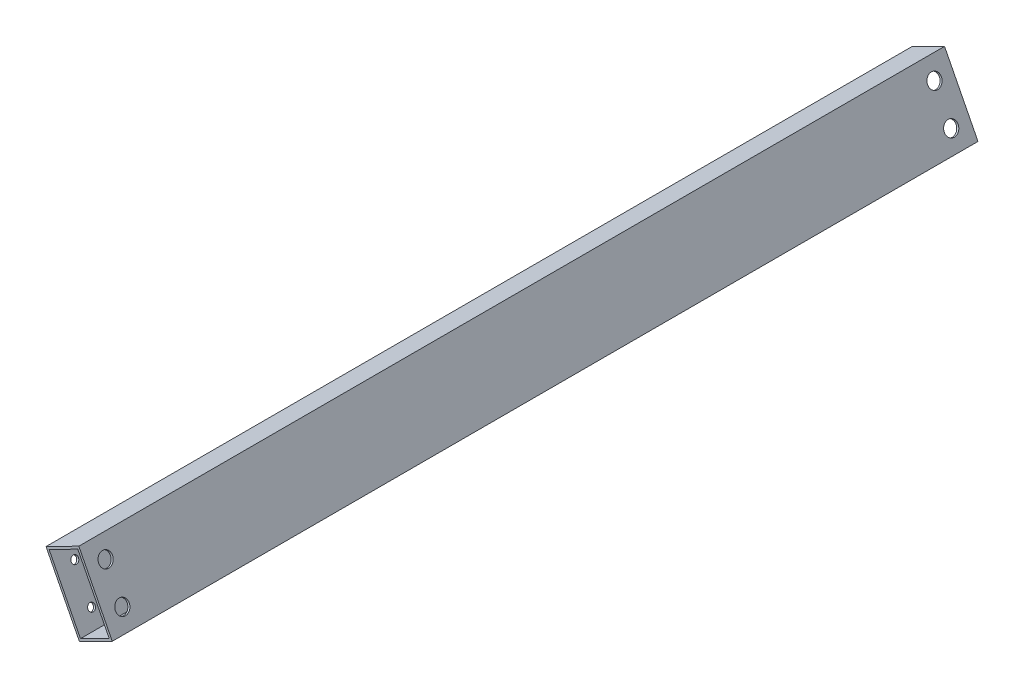
ISO-10303-21;
HEADER;
FILE_DESCRIPTION(('STEP AP214'),'2;1');
FILE_NAME('part.step','',(''),(''),'','','');
FILE_SCHEMA(('AUTOMOTIVE_DESIGN { 1 0 10303 214 1 1 1 1 }'));
ENDSEC;
DATA;
#1=APPLICATION_CONTEXT('core data for automotive mechanical design processes');
#2=APPLICATION_PROTOCOL_DEFINITION('international standard','automotive_design',2000,#1);
#3=PRODUCT_CONTEXT('',#1,'mechanical');
#4=PRODUCT('Part','Part','',(#3));
#5=PRODUCT_RELATED_PRODUCT_CATEGORY('part','',(#4));
#6=PRODUCT_DEFINITION_FORMATION('','',#4);
#7=PRODUCT_DEFINITION_CONTEXT('part definition',#1,'design');
#8=PRODUCT_DEFINITION('design','',#6,#7);
#9=PRODUCT_DEFINITION_SHAPE('','',#8);
#10=(LENGTH_UNIT() NAMED_UNIT(*) SI_UNIT(.MILLI.,.METRE.));
#11=(NAMED_UNIT(*) PLANE_ANGLE_UNIT() SI_UNIT($,.RADIAN.));
#12=(NAMED_UNIT(*) SI_UNIT($,.STERADIAN.) SOLID_ANGLE_UNIT());
#13=UNCERTAINTY_MEASURE_WITH_UNIT(LENGTH_MEASURE(1.E-05),#10,'distance_accuracy_value','');
#14=(GEOMETRIC_REPRESENTATION_CONTEXT(3) GLOBAL_UNCERTAINTY_ASSIGNED_CONTEXT((#13)) GLOBAL_UNIT_ASSIGNED_CONTEXT((#10,
#11,#12)) REPRESENTATION_CONTEXT('',''));
#15=CARTESIAN_POINT('',(0.,0.,0.));
#16=DIRECTION('',(0.,0.,1.));
#17=DIRECTION('',(1.,0.,0.));
#18=AXIS2_PLACEMENT_3D('',#15,#16,#17);
#19=CARTESIAN_POINT('',(327.781207122114,625.19456346968,298.45));
#20=DIRECTION('',(0.,0.,1.));
#21=DIRECTION('',(1.,0.,0.));
#22=AXIS2_PLACEMENT_3D('',#19,#20,#21);
#23=PLANE('',#22);
#24=DIRECTION('',(0.453990499739551,-0.891006524188366,0.));
#25=VECTOR('',#24,1.);
#26=CARTESIAN_POINT('',(350.412772836498,636.725922163065,298.45));
#27=LINE('',#26,#25);
#28=CARTESIAN_POINT('',(327.350055449729,681.989053591834,298.45));
#29=VERTEX_POINT('',#28);
#30=CARTESIAN_POINT('',(350.412772836498,636.725922163065,298.45));
#31=VERTEX_POINT('',#30);
#32=EDGE_CURVE('E135',#29,#31,#27,.T.);
#33=ORIENTED_EDGE('',*,*,#32,.F.);
#34=DIRECTION('',(0.891006524188365,0.453990499739552,0.));
#35=VECTOR('',#34,1.);
#36=CARTESIAN_POINT('',(304.718489735344,670.457694898449,298.45));
#37=LINE('',#36,#35);
#38=CARTESIAN_POINT('',(304.718489735344,670.457694898449,298.45));
#39=VERTEX_POINT('',#38);
#40=EDGE_CURVE('E11',#39,#29,#37,.T.);
#41=ORIENTED_EDGE('',*,*,#40,.F.);
#42=DIRECTION('',(0.453990499739551,-0.891006524188366,0.));
#43=VECTOR('',#42,1.);
#44=CARTESIAN_POINT('',(327.781207122114,625.19456346968,298.45));
#45=LINE('',#44,#43);
#46=CARTESIAN_POINT('',(327.781207122114,625.19456346968,298.45));
#47=VERTEX_POINT('',#46);
#48=EDGE_CURVE('E140',#39,#47,#45,.T.);
#49=ORIENTED_EDGE('',*,*,#48,.T.);
#50=DIRECTION('',(0.891006524188365,0.453990499739552,0.));
#51=VECTOR('',#50,1.);
#52=CARTESIAN_POINT('',(327.781207122114,625.19456346968,298.45));
#53=LINE('',#52,#51);
#54=EDGE_CURVE('E42',#47,#31,#53,.T.);
#55=ORIENTED_EDGE('',*,*,#54,.T.);
#56=EDGE_LOOP('',(#33,#41,#49,#55));
#57=FACE_BOUND('',#56,.T.);
#58=DIRECTION('',(0.891006524188365,0.453990499739552,0.));
#59=VECTOR('',#58,1.);
#60=CARTESIAN_POINT('',(305.439199653681,669.0432220413,298.45));
#61=LINE('',#60,#59);
#62=CARTESIAN_POINT('',(306.85367251083,669.763931959637,298.45));
#63=VERTEX_POINT('',#62);
#64=CARTESIAN_POINT('',(326.656292510917,679.853870816348,298.45));
#65=VERTEX_POINT('',#64);
#66=EDGE_CURVE('E112',#63,#65,#61,.T.);
#67=ORIENTED_EDGE('',*,*,#66,.T.);
#68=DIRECTION('',(0.453990499739551,-0.891006524188366,0.));
#69=VECTOR('',#68,1.);
#70=CARTESIAN_POINT('',(348.998299979349,636.005212244728,298.45));
#71=LINE('',#70,#69);
#72=CARTESIAN_POINT('',(348.277590061013,637.419685101878,298.45));
#73=VERTEX_POINT('',#72);
#74=EDGE_CURVE('E121',#65,#73,#71,.T.);
#75=ORIENTED_EDGE('',*,*,#74,.T.);
#76=DIRECTION('',(0.891006524188365,0.453990499739552,0.));
#77=VECTOR('',#76,1.);
#78=CARTESIAN_POINT('',(327.060497203777,626.609036326829,298.45));
#79=LINE('',#78,#77);
#80=CARTESIAN_POINT('',(328.474970060926,627.329746245166,298.45));
#81=VERTEX_POINT('',#80);
#82=EDGE_CURVE('E130',#81,#73,#79,.T.);
#83=ORIENTED_EDGE('',*,*,#82,.F.);
#84=DIRECTION('',(0.453990499739551,-0.891006524188366,0.));
#85=VECTOR('',#84,1.);
#86=CARTESIAN_POINT('',(329.195679979263,625.915273388017,298.45));
#87=LINE('',#86,#85);
#88=EDGE_CURVE('E55',#63,#81,#87,.T.);
#89=ORIENTED_EDGE('',*,*,#88,.F.);
#90=EDGE_LOOP('',(#67,#75,#83,#89));
#91=FACE_BOUND('',#90,.T.);
#92=ADVANCED_FACE('F39',(#57,#91),#23,.T.);
#93=CARTESIAN_POINT('',(327.781207122114,625.19456346968,-298.45));
#94=DIRECTION('',(0.,0.,-1.));
#95=DIRECTION('',(-1.,0.,0.));
#96=AXIS2_PLACEMENT_3D('',#93,#94,#95);
#97=PLANE('',#96);
#98=DIRECTION('',(-0.453990499739551,0.891006524188366,0.));
#99=VECTOR('',#98,1.);
#100=CARTESIAN_POINT('',(350.412772836498,636.725922163065,-298.45));
#101=LINE('',#100,#99);
#102=CARTESIAN_POINT('',(350.412772836498,636.725922163065,-298.45));
#103=VERTEX_POINT('',#102);
#104=CARTESIAN_POINT('',(327.350055449729,681.989053591834,-298.45));
#105=VERTEX_POINT('',#104);
#106=EDGE_CURVE('E158',#103,#105,#101,.T.);
#107=ORIENTED_EDGE('',*,*,#106,.F.);
#108=DIRECTION('',(0.891006524188365,0.453990499739552,0.));
#109=VECTOR('',#108,1.);
#110=CARTESIAN_POINT('',(327.781207122114,625.19456346968,-298.45));
#111=LINE('',#110,#109);
#112=CARTESIAN_POINT('',(327.781207122114,625.19456346968,-298.45));
#113=VERTEX_POINT('',#112);
#114=EDGE_CURVE('E163',#113,#103,#111,.T.);
#115=ORIENTED_EDGE('',*,*,#114,.F.);
#116=DIRECTION('',(-0.453990499739551,0.891006524188366,0.));
#117=VECTOR('',#116,1.);
#118=CARTESIAN_POINT('',(327.781207122114,625.19456346968,-298.45));
#119=LINE('',#118,#117);
#120=CARTESIAN_POINT('',(304.718489735344,670.457694898449,-298.45));
#121=VERTEX_POINT('',#120);
#122=EDGE_CURVE('E147',#113,#121,#119,.T.);
#123=ORIENTED_EDGE('',*,*,#122,.T.);
#124=DIRECTION('',(0.891006524188365,0.453990499739552,0.));
#125=VECTOR('',#124,1.);
#126=CARTESIAN_POINT('',(304.718489735344,670.457694898449,-298.45));
#127=LINE('',#126,#125);
#128=EDGE_CURVE('E47',#121,#105,#127,.T.);
#129=ORIENTED_EDGE('',*,*,#128,.T.);
#130=EDGE_LOOP('',(#107,#115,#123,#129));
#131=FACE_BOUND('',#130,.T.);
#132=DIRECTION('',(0.891006524188365,0.453990499739552,0.));
#133=VECTOR('',#132,1.);
#134=CARTESIAN_POINT('',(327.060497203777,626.609036326829,-298.45));
#135=LINE('',#134,#133);
#136=CARTESIAN_POINT('',(328.474970060926,627.329746245166,-298.45));
#137=VERTEX_POINT('',#136);
#138=CARTESIAN_POINT('',(348.277590061013,637.419685101878,-298.45));
#139=VERTEX_POINT('',#138);
#140=EDGE_CURVE('E113',#137,#139,#135,.T.);
#141=ORIENTED_EDGE('',*,*,#140,.T.);
#142=DIRECTION('',(-0.453990499739551,0.891006524188366,0.));
#143=VECTOR('',#142,1.);
#144=CARTESIAN_POINT('',(348.998299979349,636.005212244728,-298.45));
#145=LINE('',#144,#143);
#146=CARTESIAN_POINT('',(326.656292510917,679.853870816348,-298.45));
#147=VERTEX_POINT('',#146);
#148=EDGE_CURVE('E118',#139,#147,#145,.T.);
#149=ORIENTED_EDGE('',*,*,#148,.T.);
#150=DIRECTION('',(0.891006524188365,0.453990499739552,0.));
#151=VECTOR('',#150,1.);
#152=CARTESIAN_POINT('',(305.439199653681,669.0432220413,-298.45));
#153=LINE('',#152,#151);
#154=CARTESIAN_POINT('',(306.85367251083,669.763931959637,-298.45));
#155=VERTEX_POINT('',#154);
#156=EDGE_CURVE('E104',#155,#147,#153,.T.);
#157=ORIENTED_EDGE('',*,*,#156,.F.);
#158=DIRECTION('',(-0.453990499739551,0.891006524188366,0.));
#159=VECTOR('',#158,1.);
#160=CARTESIAN_POINT('',(329.195679979263,625.915273388017,-298.45));
#161=LINE('',#160,#159);
#162=EDGE_CURVE('E131',#137,#155,#161,.T.);
#163=ORIENTED_EDGE('',*,*,#162,.F.);
#164=EDGE_LOOP('',(#141,#149,#157,#163));
#165=FACE_BOUND('',#164,.T.);
#166=ADVANCED_FACE('F124',(#131,#165),#97,.T.);
#167=CARTESIAN_POINT('',(304.718489735344,670.457694898449,298.45));
#168=DIRECTION('',(-0.453990499739552,0.891006524188365,0.));
#169=DIRECTION('',(-0.891006524188365,-0.453990499739552,0.));
#170=AXIS2_PLACEMENT_3D('',#167,#168,#169);
#171=PLANE('',#170);
#172=DIRECTION('',(0.,0.,1.));
#173=VECTOR('',#172,1.);
#174=CARTESIAN_POINT('',(327.350055449729,681.989053591834,298.45));
#175=LINE('',#174,#173);
#176=EDGE_CURVE('E144',#105,#29,#175,.T.);
#177=ORIENTED_EDGE('',*,*,#176,.F.);
#178=ORIENTED_EDGE('',*,*,#128,.F.);
#179=DIRECTION('',(0.,0.,1.));
#180=VECTOR('',#179,1.);
#181=CARTESIAN_POINT('',(304.718489735344,670.457694898449,298.45));
#182=LINE('',#181,#180);
#183=EDGE_CURVE('E150',#121,#39,#182,.T.);
#184=ORIENTED_EDGE('',*,*,#183,.T.);
#185=ORIENTED_EDGE('',*,*,#40,.T.);
#186=EDGE_LOOP('',(#177,#178,#184,#185));
#187=FACE_BOUND('',#186,.T.);
#188=ADVANCED_FACE('F177',(#187),#171,.T.);
#189=CARTESIAN_POINT('',(327.781207122114,625.19456346968,298.45));
#190=DIRECTION('',(0.453990499739552,-0.891006524188365,0.));
#191=DIRECTION('',(0.891006524188365,0.453990499739552,0.));
#192=AXIS2_PLACEMENT_3D('',#189,#190,#191);
#193=PLANE('',#192);
#194=DIRECTION('',(0.,0.,-1.));
#195=VECTOR('',#194,1.);
#196=CARTESIAN_POINT('',(350.412772836498,636.725922163065,298.45));
#197=LINE('',#196,#195);
#198=EDGE_CURVE('E155',#31,#103,#197,.T.);
#199=ORIENTED_EDGE('',*,*,#198,.F.);
#200=ORIENTED_EDGE('',*,*,#54,.F.);
#201=DIRECTION('',(0.,0.,-1.));
#202=VECTOR('',#201,1.);
#203=CARTESIAN_POINT('',(327.781207122114,625.19456346968,298.45));
#204=LINE('',#203,#202);
#205=EDGE_CURVE('E143',#47,#113,#204,.T.);
#206=ORIENTED_EDGE('',*,*,#205,.T.);
#207=ORIENTED_EDGE('',*,*,#114,.T.);
#208=EDGE_LOOP('',(#199,#200,#206,#207));
#209=FACE_BOUND('',#208,.T.);
#210=ADVANCED_FACE('F172',(#209),#193,.T.);
#211=CARTESIAN_POINT('',(513.119596642458,261.447493123652,0.));
#212=DIRECTION('',(-0.891006524188366,-0.453990499739551,0.));
#213=DIRECTION('',(0.453990499739551,-0.891006524188366,0.));
#214=AXIS2_PLACEMENT_3D('',#211,#212,#213);
#215=PLANE('',#214);
#216=CARTESIAN_POINT('',(322.015527775421,636.510346326873,-285.75));
#217=DIRECTION('',(-0.891006524188366,-0.453990499739551,0.));
#218=DIRECTION('',(0.453990499739551,-0.891006524188366,0.));
#219=AXIS2_PLACEMENT_3D('',#216,#217,#218);
#220=CIRCLE('',#219,2.48919999999997);
#221=CARTESIAN_POINT('',(323.145600927373,634.292452886863,-285.75));
#222=VERTEX_POINT('',#221);
#223=EDGE_CURVE('E252',#222,#222,#220,.F.);
#224=ORIENTED_EDGE('',*,*,#223,.T.);
#225=EDGE_LOOP('',(#224));
#226=FACE_BOUND('',#225,.T.);
#227=CARTESIAN_POINT('',(310.484169082037,659.141912041257,-285.75));
#228=DIRECTION('',(-0.891006524188366,-0.453990499739551,0.));
#229=DIRECTION('',(0.453990499739551,-0.891006524188366,0.));
#230=AXIS2_PLACEMENT_3D('',#227,#228,#229);
#231=CIRCLE('',#230,2.48920000000003);
#232=CARTESIAN_POINT('',(311.614242233989,656.924018601247,-285.75));
#233=VERTEX_POINT('',#232);
#234=EDGE_CURVE('E256',#233,#233,#231,.F.);
#235=ORIENTED_EDGE('',*,*,#234,.T.);
#236=EDGE_LOOP('',(#235));
#237=FACE_BOUND('',#236,.T.);
#238=CARTESIAN_POINT('',(322.015527775421,636.510346326873,285.75));
#239=DIRECTION('',(-0.891006524188366,-0.453990499739551,0.));
#240=DIRECTION('',(0.453990499739551,-0.891006524188366,0.));
#241=AXIS2_PLACEMENT_3D('',#238,#239,#240);
#242=CIRCLE('',#241,2.48919999999997);
#243=CARTESIAN_POINT('',(323.145600927373,634.292452886863,285.75));
#244=VERTEX_POINT('',#243);
#245=EDGE_CURVE('E286',#244,#244,#242,.T.);
#246=ORIENTED_EDGE('',*,*,#245,.F.);
#247=EDGE_LOOP('',(#246));
#248=FACE_BOUND('',#247,.T.);
#249=CARTESIAN_POINT('',(310.484169082037,659.141912041257,285.75));
#250=DIRECTION('',(-0.891006524188366,-0.453990499739551,0.));
#251=DIRECTION('',(0.453990499739551,-0.891006524188366,0.));
#252=AXIS2_PLACEMENT_3D('',#249,#250,#251);
#253=CIRCLE('',#252,2.48920000000003);
#254=CARTESIAN_POINT('',(311.614242233989,656.924018601247,285.75));
#255=VERTEX_POINT('',#254);
#256=EDGE_CURVE('E281',#255,#255,#253,.T.);
#257=ORIENTED_EDGE('',*,*,#256,.F.);
#258=EDGE_LOOP('',(#257));
#259=FACE_BOUND('',#258,.T.);
#260=ORIENTED_EDGE('',*,*,#48,.F.);
#261=ORIENTED_EDGE('',*,*,#183,.F.);
#262=ORIENTED_EDGE('',*,*,#122,.F.);
#263=ORIENTED_EDGE('',*,*,#205,.F.);
#264=EDGE_LOOP('',(#260,#261,#262,#263));
#265=FACE_BOUND('',#264,.T.);
#266=ADVANCED_FACE('F180',(#226,#237,#248,#259,#265),#215,.T.);
#267=CARTESIAN_POINT('',(535.751162356843,272.978851817036,0.));
#268=DIRECTION('',(-0.891006524188366,-0.453990499739551,0.));
#269=DIRECTION('',(0.453990499739551,-0.891006524188366,0.));
#270=AXIS2_PLACEMENT_3D('',#267,#268,#269);
#271=PLANE('',#270);
#272=CARTESIAN_POINT('',(333.115734796421,670.673270734642,-285.75));
#273=DIRECTION('',(-0.891006524188366,-0.453990499739551,0.));
#274=DIRECTION('',(-0.453990499739551,0.891006524188366,0.));
#275=AXIS2_PLACEMENT_3D('',#272,#273,#274);
#276=CIRCLE('',#275,4.76250000000002);
#277=CARTESIAN_POINT('',(330.953605041412,674.916689306089,-285.75));
#278=VERTEX_POINT('',#277);
#279=EDGE_CURVE('E266',#278,#278,#276,.T.);
#280=ORIENTED_EDGE('',*,*,#279,.T.);
#281=EDGE_LOOP('',(#280));
#282=FACE_BOUND('',#281,.T.);
#283=CARTESIAN_POINT('',(344.647093489806,648.041705020257,-285.75));
#284=DIRECTION('',(-0.891006524188366,-0.453990499739551,0.));
#285=DIRECTION('',(-0.453990499739551,0.891006524188366,0.));
#286=AXIS2_PLACEMENT_3D('',#283,#284,#285);
#287=CIRCLE('',#286,4.76250000000002);
#288=CARTESIAN_POINT('',(342.484963734796,652.285123591704,-285.75));
#289=VERTEX_POINT('',#288);
#290=EDGE_CURVE('E265',#289,#289,#287,.T.);
#291=ORIENTED_EDGE('',*,*,#290,.T.);
#292=EDGE_LOOP('',(#291));
#293=FACE_BOUND('',#292,.T.);
#294=CARTESIAN_POINT('',(333.115734796421,670.673270734642,285.75));
#295=DIRECTION('',(0.891006524188366,0.453990499739551,0.));
#296=DIRECTION('',(-0.453990499739551,0.891006524188366,0.));
#297=AXIS2_PLACEMENT_3D('',#294,#295,#296);
#298=CIRCLE('',#297,4.76250000000002);
#299=CARTESIAN_POINT('',(330.953605041412,674.916689306089,285.75));
#300=VERTEX_POINT('',#299);
#301=EDGE_CURVE('E290',#300,#300,#298,.T.);
#302=ORIENTED_EDGE('',*,*,#301,.F.);
#303=EDGE_LOOP('',(#302));
#304=FACE_BOUND('',#303,.T.);
#305=CARTESIAN_POINT('',(344.647093489806,648.041705020257,285.75));
#306=DIRECTION('',(0.891006524188366,0.453990499739551,0.));
#307=DIRECTION('',(-0.453990499739551,0.891006524188366,0.));
#308=AXIS2_PLACEMENT_3D('',#305,#306,#307);
#309=CIRCLE('',#308,4.76250000000002);
#310=CARTESIAN_POINT('',(342.484963734796,652.285123591704,285.75));
#311=VERTEX_POINT('',#310);
#312=EDGE_CURVE('E293',#311,#311,#309,.T.);
#313=ORIENTED_EDGE('',*,*,#312,.F.);
#314=EDGE_LOOP('',(#313));
#315=FACE_BOUND('',#314,.T.);
#316=ORIENTED_EDGE('',*,*,#32,.T.);
#317=ORIENTED_EDGE('',*,*,#198,.T.);
#318=ORIENTED_EDGE('',*,*,#106,.T.);
#319=ORIENTED_EDGE('',*,*,#176,.T.);
#320=EDGE_LOOP('',(#316,#317,#318,#319));
#321=FACE_BOUND('',#320,.T.);
#322=ADVANCED_FACE('F174',(#282,#293,#304,#315,#321),#271,.F.);
#323=CARTESIAN_POINT('',(305.439199653681,669.0432220413,298.45));
#324=DIRECTION('',(-0.453990499739552,0.891006524188365,0.));
#325=DIRECTION('',(-0.891006524188365,-0.453990499739552,0.));
#326=AXIS2_PLACEMENT_3D('',#323,#324,#325);
#327=PLANE('',#326);
#328=DIRECTION('',(0.,0.,1.));
#329=VECTOR('',#328,1.);
#330=CARTESIAN_POINT('',(326.656292510917,679.853870816348,298.45));
#331=LINE('',#330,#329);
#332=EDGE_CURVE('E107',#147,#65,#331,.T.);
#333=ORIENTED_EDGE('',*,*,#332,.T.);
#334=ORIENTED_EDGE('',*,*,#66,.F.);
#335=DIRECTION('',(0.,0.,1.));
#336=VECTOR('',#335,1.);
#337=CARTESIAN_POINT('',(306.85367251083,669.763931959637,298.45));
#338=LINE('',#337,#336);
#339=EDGE_CURVE('E62',#155,#63,#338,.T.);
#340=ORIENTED_EDGE('',*,*,#339,.F.);
#341=ORIENTED_EDGE('',*,*,#156,.T.);
#342=EDGE_LOOP('',(#333,#334,#340,#341));
#343=FACE_BOUND('',#342,.T.);
#344=ADVANCED_FACE('F106',(#343),#327,.F.);
#345=CARTESIAN_POINT('',(327.060497203777,626.609036326829,298.45));
#346=DIRECTION('',(0.453990499739552,-0.891006524188365,0.));
#347=DIRECTION('',(0.891006524188365,0.453990499739552,0.));
#348=AXIS2_PLACEMENT_3D('',#345,#346,#347);
#349=PLANE('',#348);
#350=DIRECTION('',(0.,0.,-1.));
#351=VECTOR('',#350,1.);
#352=CARTESIAN_POINT('',(348.277590061013,637.419685101878,298.45));
#353=LINE('',#352,#351);
#354=EDGE_CURVE('E125',#73,#139,#353,.T.);
#355=ORIENTED_EDGE('',*,*,#354,.T.);
#356=ORIENTED_EDGE('',*,*,#140,.F.);
#357=DIRECTION('',(0.,0.,-1.));
#358=VECTOR('',#357,1.);
#359=CARTESIAN_POINT('',(328.474970060926,627.329746245166,298.45));
#360=LINE('',#359,#358);
#361=EDGE_CURVE('E133',#81,#137,#360,.T.);
#362=ORIENTED_EDGE('',*,*,#361,.F.);
#363=ORIENTED_EDGE('',*,*,#82,.T.);
#364=EDGE_LOOP('',(#355,#356,#362,#363));
#365=FACE_BOUND('',#364,.T.);
#366=ADVANCED_FACE('F211',(#365),#349,.F.);
#367=CARTESIAN_POINT('',(514.534069499607,262.168203041988,0.));
#368=DIRECTION('',(-0.891006524188366,-0.453990499739551,0.));
#369=DIRECTION('',(0.453990499739551,-0.891006524188366,0.));
#370=AXIS2_PLACEMENT_3D('',#367,#368,#369);
#371=PLANE('',#370);
#372=CARTESIAN_POINT('',(323.430000632571,637.231056245209,-285.75));
#373=DIRECTION('',(-0.891006524188366,-0.453990499739551,0.));
#374=DIRECTION('',(-0.453990499739551,0.891006524188366,0.));
#375=AXIS2_PLACEMENT_3D('',#372,#373,#374);
#376=CIRCLE('',#375,2.48919999999997);
#377=CARTESIAN_POINT('',(322.299927480619,639.448949685219,-285.75));
#378=VERTEX_POINT('',#377);
#379=EDGE_CURVE('E255',#378,#378,#376,.T.);
#380=ORIENTED_EDGE('',*,*,#379,.T.);
#381=EDGE_LOOP('',(#380));
#382=FACE_BOUND('',#381,.T.);
#383=CARTESIAN_POINT('',(311.898641939186,659.862621959594,-285.75));
#384=DIRECTION('',(-0.891006524188366,-0.453990499739551,0.));
#385=DIRECTION('',(-0.453990499739551,0.891006524188366,0.));
#386=AXIS2_PLACEMENT_3D('',#383,#384,#385);
#387=CIRCLE('',#386,2.48920000000003);
#388=CARTESIAN_POINT('',(310.768568787234,662.080515399603,-285.75));
#389=VERTEX_POINT('',#388);
#390=EDGE_CURVE('E257',#389,#389,#387,.T.);
#391=ORIENTED_EDGE('',*,*,#390,.T.);
#392=EDGE_LOOP('',(#391));
#393=FACE_BOUND('',#392,.T.);
#394=CARTESIAN_POINT('',(323.430000632571,637.231056245209,285.75));
#395=DIRECTION('',(0.891006524188366,0.453990499739551,0.));
#396=DIRECTION('',(-0.453990499739551,0.891006524188366,0.));
#397=AXIS2_PLACEMENT_3D('',#394,#395,#396);
#398=CIRCLE('',#397,2.48919999999997);
#399=CARTESIAN_POINT('',(322.299927480619,639.448949685219,285.75));
#400=VERTEX_POINT('',#399);
#401=EDGE_CURVE('E278',#400,#400,#398,.T.);
#402=ORIENTED_EDGE('',*,*,#401,.F.);
#403=EDGE_LOOP('',(#402));
#404=FACE_BOUND('',#403,.T.);
#405=CARTESIAN_POINT('',(311.898641939186,659.862621959594,285.75));
#406=DIRECTION('',(0.891006524188366,0.453990499739551,0.));
#407=DIRECTION('',(-0.453990499739551,0.891006524188366,0.));
#408=AXIS2_PLACEMENT_3D('',#405,#406,#407);
#409=CIRCLE('',#408,2.48920000000003);
#410=CARTESIAN_POINT('',(310.768568787234,662.080515399603,285.75));
#411=VERTEX_POINT('',#410);
#412=EDGE_CURVE('E273',#411,#411,#409,.T.);
#413=ORIENTED_EDGE('',*,*,#412,.F.);
#414=EDGE_LOOP('',(#413));
#415=FACE_BOUND('',#414,.T.);
#416=ORIENTED_EDGE('',*,*,#88,.T.);
#417=ORIENTED_EDGE('',*,*,#361,.T.);
#418=ORIENTED_EDGE('',*,*,#162,.T.);
#419=ORIENTED_EDGE('',*,*,#339,.T.);
#420=EDGE_LOOP('',(#416,#417,#418,#419));
#421=FACE_BOUND('',#420,.T.);
#422=ADVANCED_FACE('F207',(#382,#393,#404,#415,#421),#371,.F.);
#423=CARTESIAN_POINT('',(534.336689499694,272.2581418987,0.));
#424=DIRECTION('',(-0.891006524188366,-0.453990499739551,0.));
#425=DIRECTION('',(0.453990499739551,-0.891006524188366,0.));
#426=AXIS2_PLACEMENT_3D('',#423,#424,#425);
#427=PLANE('',#426);
#428=CARTESIAN_POINT('',(331.701261939272,669.952560816305,-285.75));
#429=DIRECTION('',(-0.891006524188366,-0.453990499739551,0.));
#430=DIRECTION('',(0.453990499739551,-0.891006524188366,0.));
#431=AXIS2_PLACEMENT_3D('',#428,#429,#430);
#432=CIRCLE('',#431,4.76250000000002);
#433=CARTESIAN_POINT('',(329.539132184263,674.195979387752,-285.75));
#434=VERTEX_POINT('',#433);
#435=EDGE_CURVE('E269',#434,#434,#432,.T.);
#436=ORIENTED_EDGE('',*,*,#435,.F.);
#437=EDGE_LOOP('',(#436));
#438=FACE_BOUND('',#437,.T.);
#439=CARTESIAN_POINT('',(343.232620632657,647.320995101921,-285.75));
#440=DIRECTION('',(-0.891006524188366,-0.453990499739551,0.));
#441=DIRECTION('',(0.453990499739551,-0.891006524188366,0.));
#442=AXIS2_PLACEMENT_3D('',#439,#440,#441);
#443=CIRCLE('',#442,4.76250000000002);
#444=CARTESIAN_POINT('',(341.070490877647,651.564413673368,-285.75));
#445=VERTEX_POINT('',#444);
#446=EDGE_CURVE('E270',#445,#445,#443,.T.);
#447=ORIENTED_EDGE('',*,*,#446,.F.);
#448=EDGE_LOOP('',(#447));
#449=FACE_BOUND('',#448,.T.);
#450=CARTESIAN_POINT('',(331.701261939272,669.952560816305,285.75));
#451=DIRECTION('',(-0.891006524188366,-0.453990499739551,0.));
#452=DIRECTION('',(0.453990499739551,-0.891006524188366,0.));
#453=AXIS2_PLACEMENT_3D('',#450,#451,#452);
#454=CIRCLE('',#453,4.76250000000002);
#455=CARTESIAN_POINT('',(329.539132184263,674.195979387752,285.75));
#456=VERTEX_POINT('',#455);
#457=EDGE_CURVE('E139',#456,#456,#454,.F.);
#458=ORIENTED_EDGE('',*,*,#457,.T.);
#459=EDGE_LOOP('',(#458));
#460=FACE_BOUND('',#459,.T.);
#461=CARTESIAN_POINT('',(343.232620632657,647.320995101921,285.75));
#462=DIRECTION('',(-0.891006524188366,-0.453990499739551,0.));
#463=DIRECTION('',(0.453990499739551,-0.891006524188366,0.));
#464=AXIS2_PLACEMENT_3D('',#461,#462,#463);
#465=CIRCLE('',#464,4.76250000000002);
#466=CARTESIAN_POINT('',(341.070490877647,651.564413673368,285.75));
#467=VERTEX_POINT('',#466);
#468=EDGE_CURVE('E289',#467,#467,#465,.F.);
#469=ORIENTED_EDGE('',*,*,#468,.T.);
#470=EDGE_LOOP('',(#469));
#471=FACE_BOUND('',#470,.T.);
#472=ORIENTED_EDGE('',*,*,#74,.F.);
#473=ORIENTED_EDGE('',*,*,#332,.F.);
#474=ORIENTED_EDGE('',*,*,#148,.F.);
#475=ORIENTED_EDGE('',*,*,#354,.F.);
#476=EDGE_LOOP('',(#472,#473,#474,#475));
#477=FACE_BOUND('',#476,.T.);
#478=ADVANCED_FACE('F116',(#438,#449,#460,#471,#477),#427,.T.);
#479=CARTESIAN_POINT('',(331.230420443524,641.205568655631,285.75));
#480=DIRECTION('',(0.891006524188365,0.453990499739551,0.));
#481=DIRECTION('',(-0.453990499739551,0.891006524188366,0.));
#482=AXIS2_PLACEMENT_3D('',#479,#480,#481);
#483=CYLINDRICAL_SURFACE('',#482,4.76250000000002);
#484=CARTESIAN_POINT('',(342.484963734796,652.285123591704,285.75));
#485=CARTESIAN_POINT('',(342.470229642534,652.277616196722,285.75));
#486=CARTESIAN_POINT('',(342.455495550272,652.270108801739,285.75));
#487=CARTESIAN_POINT('',(342.426027365748,652.255094011774,285.75));
#488=CARTESIAN_POINT('',(342.411293273487,652.247586616791,285.75));
#489=CARTESIAN_POINT('',(342.381825088963,652.232571826826,285.75));
#490=CARTESIAN_POINT('',(342.367090996701,652.225064431843,285.75));
#491=CARTESIAN_POINT('',(342.337622812177,652.210049641878,285.75));
#492=CARTESIAN_POINT('',(342.322888719915,652.202542246895,285.75));
#493=CARTESIAN_POINT('',(342.293420535391,652.18752745693,285.75));
#494=CARTESIAN_POINT('',(342.278686443129,652.180020061947,285.75));
#495=CARTESIAN_POINT('',(342.249218258605,652.165005271982,285.75));
#496=CARTESIAN_POINT('',(342.234484166343,652.157497876999,285.75));
#497=CARTESIAN_POINT('',(342.205015981819,652.142483087034,285.75));
#498=CARTESIAN_POINT('',(342.190281889557,652.134975692051,285.75));
#499=CARTESIAN_POINT('',(342.160813705033,652.119960902086,285.75));
#500=CARTESIAN_POINT('',(342.146079612771,652.112453507103,285.75));
#501=CARTESIAN_POINT('',(342.116611428247,652.097438717137,285.75));
#502=CARTESIAN_POINT('',(342.101877335985,652.089931322155,285.75));
#503=CARTESIAN_POINT('',(342.072409151461,652.074916532189,285.75));
#504=CARTESIAN_POINT('',(342.057675059199,652.067409137207,285.75));
#505=CARTESIAN_POINT('',(342.028206874675,652.052394347241,285.75));
#506=CARTESIAN_POINT('',(342.013472782413,652.044886952259,285.75));
#507=CARTESIAN_POINT('',(341.984004597889,652.029872162293,285.75));
#508=CARTESIAN_POINT('',(341.969270505627,652.022364767311,285.75));
#509=CARTESIAN_POINT('',(341.939802321104,652.007349977346,285.75));
#510=CARTESIAN_POINT('',(341.925068228842,651.999842582363,285.75));
#511=CARTESIAN_POINT('',(341.895600044318,651.984827792397,285.75));
#512=CARTESIAN_POINT('',(341.880865952056,651.977320397415,285.75));
#513=CARTESIAN_POINT('',(341.851397767532,651.962305607449,285.75));
#514=CARTESIAN_POINT('',(341.83666367527,651.954798212467,285.75));
#515=CARTESIAN_POINT('',(341.807195490746,651.939783422501,285.75));
#516=CARTESIAN_POINT('',(341.792461398484,651.932276027519,285.75));
#517=CARTESIAN_POINT('',(341.76299321396,651.917261237553,285.75));
#518=CARTESIAN_POINT('',(341.748259121698,651.909753842571,285.75));
#519=CARTESIAN_POINT('',(341.718790937174,651.894739052605,285.75));
#520=CARTESIAN_POINT('',(341.704056844912,651.887231657623,285.75));
#521=CARTESIAN_POINT('',(341.674588660388,651.872216867657,285.75));
#522=CARTESIAN_POINT('',(341.659854568126,651.864709472675,285.75));
#523=CARTESIAN_POINT('',(341.630386383602,651.849694682709,285.75));
#524=CARTESIAN_POINT('',(341.61565229134,651.842187287727,285.75));
#525=CARTESIAN_POINT('',(341.586184106816,651.827172497761,285.75));
#526=CARTESIAN_POINT('',(341.571450014554,651.819665102779,285.75));
#527=CARTESIAN_POINT('',(341.54198183003,651.804650312813,285.75));
#528=CARTESIAN_POINT('',(341.527247737768,651.797142917831,285.75));
#529=CARTESIAN_POINT('',(341.497779553244,651.782128127865,285.75));
#530=CARTESIAN_POINT('',(341.483045460982,651.774620732883,285.75));
#531=CARTESIAN_POINT('',(341.453577276459,651.759605942917,285.75));
#532=CARTESIAN_POINT('',(341.438843184197,651.752098547935,285.75));
#533=CARTESIAN_POINT('',(341.409374999673,651.737083757969,285.75));
#534=CARTESIAN_POINT('',(341.394640907411,651.729576362987,285.75));
#535=CARTESIAN_POINT('',(341.365172722887,651.714561573021,285.75));
#536=CARTESIAN_POINT('',(341.350438630625,651.707054178039,285.75));
#537=CARTESIAN_POINT('',(341.320970446101,651.692039388073,285.75));
#538=CARTESIAN_POINT('',(341.306236353839,651.684531993091,285.75));
#539=CARTESIAN_POINT('',(341.276768169315,651.669517203125,285.75));
#540=CARTESIAN_POINT('',(341.262034077053,651.662009808143,285.75));
#541=CARTESIAN_POINT('',(341.232565892529,651.646995018177,285.75));
#542=CARTESIAN_POINT('',(341.217831800267,651.639487623195,285.75));
#543=CARTESIAN_POINT('',(341.188363615743,651.624472833229,285.75));
#544=CARTESIAN_POINT('',(341.173629523481,651.616965438247,285.75));
#545=CARTESIAN_POINT('',(341.144161338957,651.601950648281,285.75));
#546=CARTESIAN_POINT('',(341.129427246695,651.594443253299,285.75));
#547=CARTESIAN_POINT('',(341.099959062171,651.579428463333,285.75));
#548=CARTESIAN_POINT('',(341.085224969909,651.57192106835,285.75));
#549=CARTESIAN_POINT('',(341.070490877647,651.564413673368,285.75));
#550=B_SPLINE_CURVE_WITH_KNOTS('',3,(#484,#485,#486,#487,#488,#489,#490,#491,#492,#493,#494,
#495,#496,#497,#498,#499,#500,#501,#502,#503,#504,#505,#506,#507,#508,#509,#510,#511,#512,#513,
#514,#515,#516,#517,#518,#519,#520,#521,#522,#523,#524,#525,#526,#527,#528,#529,#530,#531,#532,
#533,#534,#535,#536,#537,#538,#539,#540,#541,#542,#543,#544,#545,#546,#547,#548,#549),
.UNSPECIFIED.,.F.,.F.,(4,2,2,2,2,2,2,2,2,2,2,2,2,2,2,2,2,2,2,2,2,2,2,2,2,2,2,2,2,2,2,2,4),(0.,
0.0496093750000163,0.0992187500000326,0.148828125000049,0.198437500000016,0.248046875000032,
0.297656250000048,0.347265625000064,0.396875000000031,0.446484375000048,0.496093750000064,
0.54570312500008,0.595312499999997,0.644921875000013,0.694531250000029,0.744140625000046,
0.793750000000012,0.843359375000029,0.892968750000045,0.942578125000061,0.992187500000028,
1.04179687500004,1.09140625000006,1.14101562500008,1.19062499999999,1.24023437500001,
1.28984375000003,1.33945312500004,1.38906250000001,1.43867187500002,1.48828125000004,
1.53789062500006,1.58750000000002),.UNSPECIFIED.);
#551=EDGE_CURVE('BSEAM206',#311,#467,#550,.T.);
#552=ORIENTED_EDGE('',*,*,#312,.T.);
#553=ORIENTED_EDGE('',*,*,#468,.F.);
#554=ORIENTED_EDGE('',*,*,#551,.T.);
#555=ORIENTED_EDGE('',*,*,#551,.F.);
#556=EDGE_LOOP('',(#552,#554,#553,#555));
#557=FACE_BOUND('',#556,.T.);
#558=ADVANCED_FACE('F206',(#557),#483,.F.);
#559=CARTESIAN_POINT('',(319.69906175014,663.837134370015,285.75));
#560=DIRECTION('',(0.891006524188365,0.453990499739551,0.));
#561=DIRECTION('',(-0.453990499739551,0.891006524188366,0.));
#562=AXIS2_PLACEMENT_3D('',#559,#560,#561);
#563=CYLINDRICAL_SURFACE('',#562,4.76250000000002);
#564=CARTESIAN_POINT('',(330.953605041412,674.916689306089,285.75));
#565=CARTESIAN_POINT('',(330.93887094915,674.909181911106,285.75));
#566=CARTESIAN_POINT('',(330.924136856888,674.901674516124,285.75));
#567=CARTESIAN_POINT('',(330.894668672364,674.886659726158,285.75));
#568=CARTESIAN_POINT('',(330.879934580102,674.879152331176,285.75));
#569=CARTESIAN_POINT('',(330.850466395578,674.86413754121,285.75));
#570=CARTESIAN_POINT('',(330.835732303316,674.856630146228,285.75));
#571=CARTESIAN_POINT('',(330.806264118792,674.841615356262,285.75));
#572=CARTESIAN_POINT('',(330.79153002653,674.83410796128,285.75));
#573=CARTESIAN_POINT('',(330.762061842006,674.819093171314,285.75));
#574=CARTESIAN_POINT('',(330.747327749744,674.811585776332,285.75));
#575=CARTESIAN_POINT('',(330.71785956522,674.796570986366,285.75));
#576=CARTESIAN_POINT('',(330.703125472958,674.789063591383,285.75));
#577=CARTESIAN_POINT('',(330.673657288434,674.774048801418,285.75));
#578=CARTESIAN_POINT('',(330.658923196172,674.766541406435,285.75));
#579=CARTESIAN_POINT('',(330.629455011648,674.75152661647,285.75));
#580=CARTESIAN_POINT('',(330.614720919386,674.744019221487,285.75));
#581=CARTESIAN_POINT('',(330.585252734862,674.729004431522,285.75));
#582=CARTESIAN_POINT('',(330.570518642601,674.721497036539,285.75));
#583=CARTESIAN_POINT('',(330.541050458077,674.706482246574,285.75));
#584=CARTESIAN_POINT('',(330.526316365815,674.698974851591,285.75));
#585=CARTESIAN_POINT('',(330.496848181291,674.683960061626,285.75));
#586=CARTESIAN_POINT('',(330.482114089029,674.676452666643,285.75));
#587=CARTESIAN_POINT('',(330.452645904505,674.661437876678,285.75));
#588=CARTESIAN_POINT('',(330.437911812243,674.653930481695,285.75));
#589=CARTESIAN_POINT('',(330.408443627719,674.63891569173,285.75));
#590=CARTESIAN_POINT('',(330.393709535457,674.631408296747,285.75));
#591=CARTESIAN_POINT('',(330.364241350933,674.616393506782,285.75));
#592=CARTESIAN_POINT('',(330.349507258671,674.608886111799,285.75));
#593=CARTESIAN_POINT('',(330.320039074147,674.593871321834,285.75));
#594=CARTESIAN_POINT('',(330.305304981885,674.586363926851,285.75));
#595=CARTESIAN_POINT('',(330.275836797361,674.571349136886,285.75));
#596=CARTESIAN_POINT('',(330.261102705099,674.563841741903,285.75));
#597=CARTESIAN_POINT('',(330.231634520575,674.548826951938,285.75));
#598=CARTESIAN_POINT('',(330.216900428313,674.541319556955,285.75));
#599=CARTESIAN_POINT('',(330.187432243789,674.52630476699,285.75));
#600=CARTESIAN_POINT('',(330.172698151527,674.518797372007,285.75));
#601=CARTESIAN_POINT('',(330.143229967003,674.503782582042,285.75));
#602=CARTESIAN_POINT('',(330.128495874741,674.496275187059,285.75));
#603=CARTESIAN_POINT('',(330.099027690218,674.481260397094,285.75));
#604=CARTESIAN_POINT('',(330.084293597956,674.473753002111,285.75));
#605=CARTESIAN_POINT('',(330.054825413432,674.458738212146,285.75));
#606=CARTESIAN_POINT('',(330.04009132117,674.451230817163,285.75));
#607=CARTESIAN_POINT('',(330.010623136646,674.436216027198,285.75));
#608=CARTESIAN_POINT('',(329.995889044384,674.428708632215,285.75));
#609=CARTESIAN_POINT('',(329.96642085986,674.41369384225,285.75));
#610=CARTESIAN_POINT('',(329.951686767598,674.406186447267,285.75));
#611=CARTESIAN_POINT('',(329.922218583074,674.391171657302,285.75));
#612=CARTESIAN_POINT('',(329.907484490812,674.383664262319,285.75));
#613=CARTESIAN_POINT('',(329.878016306288,674.368649472354,285.75));
#614=CARTESIAN_POINT('',(329.863282214026,674.361142077371,285.75));
#615=CARTESIAN_POINT('',(329.833814029502,674.346127287406,285.75));
#616=CARTESIAN_POINT('',(329.81907993724,674.338619892423,285.75));
#617=CARTESIAN_POINT('',(329.789611752716,674.323605102458,285.75));
#618=CARTESIAN_POINT('',(329.774877660454,674.316097707475,285.75));
#619=CARTESIAN_POINT('',(329.74540947593,674.30108291751,285.75));
#620=CARTESIAN_POINT('',(329.730675383668,674.293575522527,285.75));
#621=CARTESIAN_POINT('',(329.701207199144,674.278560732562,285.75));
#622=CARTESIAN_POINT('',(329.686473106882,674.271053337579,285.75));
#623=CARTESIAN_POINT('',(329.657004922358,674.256038547614,285.75));
#624=CARTESIAN_POINT('',(329.642270830096,674.248531152631,285.75));
#625=CARTESIAN_POINT('',(329.612802645573,674.233516362666,285.75));
#626=CARTESIAN_POINT('',(329.598068553311,674.226008967683,285.75));
#627=CARTESIAN_POINT('',(329.568600368787,674.210994177718,285.75));
#628=CARTESIAN_POINT('',(329.553866276525,674.203486782735,285.75));
#629=CARTESIAN_POINT('',(329.539132184263,674.195979387752,285.75));
#630=B_SPLINE_CURVE_WITH_KNOTS('',3,(#564,#565,#566,#567,#568,#569,#570,#571,#572,#573,#574,
#575,#576,#577,#578,#579,#580,#581,#582,#583,#584,#585,#586,#587,#588,#589,#590,#591,#592,#593,
#594,#595,#596,#597,#598,#599,#600,#601,#602,#603,#604,#605,#606,#607,#608,#609,#610,#611,#612,
#613,#614,#615,#616,#617,#618,#619,#620,#621,#622,#623,#624,#625,#626,#627,#628,#629),
.UNSPECIFIED.,.F.,.F.,(4,2,2,2,2,2,2,2,2,2,2,2,2,2,2,2,2,2,2,2,2,2,2,2,2,2,2,2,2,2,2,2,4),(0.,
0.0496093749999659,0.0992187499999822,0.148828124999998,0.198437500000015,0.248046874999982,
0.297656249999998,0.347265625000014,0.39687500000003,0.446484375000047,0.496093750000013,
0.54570312500003,0.595312500000046,0.644921875000062,0.694531249999979,0.744140624999995,
0.793750000000012,0.843359375000028,0.892968750000044,0.942578125000011,0.992187500000027,
1.04179687500004,1.09140625000006,1.14101562500003,1.19062500000004,1.24023437500006,
1.28984375000008,1.33945312500004,1.38906250000001,1.43867187500002,1.48828125000004,
1.53789062500006,1.58750000000002),.UNSPECIFIED.);
#631=EDGE_CURVE('BSEAM220',#300,#456,#630,.T.);
#632=ORIENTED_EDGE('',*,*,#301,.T.);
#633=ORIENTED_EDGE('',*,*,#457,.F.);
#634=ORIENTED_EDGE('',*,*,#631,.T.);
#635=ORIENTED_EDGE('',*,*,#631,.F.);
#636=EDGE_LOOP('',(#632,#634,#633,#635));
#637=FACE_BOUND('',#636,.T.);
#638=ADVANCED_FACE('F220',(#637),#563,.F.);
#639=CARTESIAN_POINT('',(292.174847809786,649.812846890075,285.75));
#640=DIRECTION('',(0.891006524188366,0.453990499739551,0.));
#641=DIRECTION('',(-0.453990499739551,0.891006524188366,0.));
#642=AXIS2_PLACEMENT_3D('',#639,#640,#641);
#643=CYLINDRICAL_SURFACE('',#642,2.48920000000003);
#644=ORIENTED_EDGE('',*,*,#256,.T.);
#645=EDGE_LOOP('',(#644));
#646=FACE_BOUND('',#645,.T.);
#647=ORIENTED_EDGE('',*,*,#412,.T.);
#648=EDGE_LOOP('',(#647));
#649=FACE_BOUND('',#648,.T.);
#650=ADVANCED_FACE('F224',(#646,#649),#643,.F.);
#651=CARTESIAN_POINT('',(303.706206503171,627.181281175691,285.75));
#652=DIRECTION('',(0.891006524188366,0.453990499739551,0.));
#653=DIRECTION('',(-0.453990499739551,0.891006524188366,0.));
#654=AXIS2_PLACEMENT_3D('',#651,#652,#653);
#655=CYLINDRICAL_SURFACE('',#654,2.48919999999997);
#656=ORIENTED_EDGE('',*,*,#245,.T.);
#657=EDGE_LOOP('',(#656));
#658=FACE_BOUND('',#657,.T.);
#659=ORIENTED_EDGE('',*,*,#401,.T.);
#660=EDGE_LOOP('',(#659));
#661=FACE_BOUND('',#660,.T.);
#662=ADVANCED_FACE('F228',(#658,#661),#655,.F.);
#663=CARTESIAN_POINT('',(331.230420443524,641.205568655631,-285.75));
#664=DIRECTION('',(0.891006524188365,0.453990499739551,0.));
#665=DIRECTION('',(-0.453990499739551,0.891006524188366,0.));
#666=AXIS2_PLACEMENT_3D('',#663,#664,#665);
#667=CYLINDRICAL_SURFACE('',#666,4.76250000000002);
#668=CARTESIAN_POINT('',(342.484963734796,652.285123591704,-285.75));
#669=CARTESIAN_POINT('',(342.470229642534,652.277616196722,-285.75));
#670=CARTESIAN_POINT('',(342.455495550272,652.270108801739,-285.75));
#671=CARTESIAN_POINT('',(342.426027365748,652.255094011774,-285.75));
#672=CARTESIAN_POINT('',(342.411293273487,652.247586616791,-285.75));
#673=CARTESIAN_POINT('',(342.381825088963,652.232571826826,-285.75));
#674=CARTESIAN_POINT('',(342.367090996701,652.225064431843,-285.75));
#675=CARTESIAN_POINT('',(342.337622812177,652.210049641878,-285.75));
#676=CARTESIAN_POINT('',(342.322888719915,652.202542246895,-285.75));
#677=CARTESIAN_POINT('',(342.293420535391,652.18752745693,-285.75));
#678=CARTESIAN_POINT('',(342.278686443129,652.180020061947,-285.75));
#679=CARTESIAN_POINT('',(342.249218258605,652.165005271982,-285.75));
#680=CARTESIAN_POINT('',(342.234484166343,652.157497876999,-285.75));
#681=CARTESIAN_POINT('',(342.205015981819,652.142483087034,-285.75));
#682=CARTESIAN_POINT('',(342.190281889557,652.134975692051,-285.75));
#683=CARTESIAN_POINT('',(342.160813705033,652.119960902086,-285.75));
#684=CARTESIAN_POINT('',(342.146079612771,652.112453507103,-285.75));
#685=CARTESIAN_POINT('',(342.116611428247,652.097438717137,-285.75));
#686=CARTESIAN_POINT('',(342.101877335985,652.089931322155,-285.75));
#687=CARTESIAN_POINT('',(342.072409151461,652.074916532189,-285.75));
#688=CARTESIAN_POINT('',(342.057675059199,652.067409137207,-285.75));
#689=CARTESIAN_POINT('',(342.028206874675,652.052394347241,-285.75));
#690=CARTESIAN_POINT('',(342.013472782413,652.044886952259,-285.75));
#691=CARTESIAN_POINT('',(341.984004597889,652.029872162293,-285.75));
#692=CARTESIAN_POINT('',(341.969270505627,652.022364767311,-285.75));
#693=CARTESIAN_POINT('',(341.939802321104,652.007349977346,-285.75));
#694=CARTESIAN_POINT('',(341.925068228842,651.999842582363,-285.75));
#695=CARTESIAN_POINT('',(341.895600044318,651.984827792397,-285.75));
#696=CARTESIAN_POINT('',(341.880865952056,651.977320397415,-285.75));
#697=CARTESIAN_POINT('',(341.851397767532,651.962305607449,-285.75));
#698=CARTESIAN_POINT('',(341.83666367527,651.954798212467,-285.75));
#699=CARTESIAN_POINT('',(341.807195490746,651.939783422501,-285.75));
#700=CARTESIAN_POINT('',(341.792461398484,651.932276027519,-285.75));
#701=CARTESIAN_POINT('',(341.76299321396,651.917261237553,-285.75));
#702=CARTESIAN_POINT('',(341.748259121698,651.909753842571,-285.75));
#703=CARTESIAN_POINT('',(341.718790937174,651.894739052605,-285.75));
#704=CARTESIAN_POINT('',(341.704056844912,651.887231657623,-285.75));
#705=CARTESIAN_POINT('',(341.674588660388,651.872216867657,-285.75));
#706=CARTESIAN_POINT('',(341.659854568126,651.864709472675,-285.75));
#707=CARTESIAN_POINT('',(341.630386383602,651.849694682709,-285.75));
#708=CARTESIAN_POINT('',(341.61565229134,651.842187287727,-285.75));
#709=CARTESIAN_POINT('',(341.586184106816,651.827172497761,-285.75));
#710=CARTESIAN_POINT('',(341.571450014554,651.819665102779,-285.75));
#711=CARTESIAN_POINT('',(341.54198183003,651.804650312813,-285.75));
#712=CARTESIAN_POINT('',(341.527247737768,651.797142917831,-285.75));
#713=CARTESIAN_POINT('',(341.497779553244,651.782128127865,-285.75));
#714=CARTESIAN_POINT('',(341.483045460982,651.774620732883,-285.75));
#715=CARTESIAN_POINT('',(341.453577276459,651.759605942917,-285.75));
#716=CARTESIAN_POINT('',(341.438843184197,651.752098547935,-285.75));
#717=CARTESIAN_POINT('',(341.409374999673,651.737083757969,-285.75));
#718=CARTESIAN_POINT('',(341.394640907411,651.729576362987,-285.75));
#719=CARTESIAN_POINT('',(341.365172722887,651.714561573021,-285.75));
#720=CARTESIAN_POINT('',(341.350438630625,651.707054178039,-285.75));
#721=CARTESIAN_POINT('',(341.320970446101,651.692039388073,-285.75));
#722=CARTESIAN_POINT('',(341.306236353839,651.684531993091,-285.75));
#723=CARTESIAN_POINT('',(341.276768169315,651.669517203125,-285.75));
#724=CARTESIAN_POINT('',(341.262034077053,651.662009808143,-285.75));
#725=CARTESIAN_POINT('',(341.232565892529,651.646995018177,-285.75));
#726=CARTESIAN_POINT('',(341.217831800267,651.639487623195,-285.75));
#727=CARTESIAN_POINT('',(341.188363615743,651.624472833229,-285.75));
#728=CARTESIAN_POINT('',(341.173629523481,651.616965438247,-285.75));
#729=CARTESIAN_POINT('',(341.144161338957,651.601950648281,-285.75));
#730=CARTESIAN_POINT('',(341.129427246695,651.594443253299,-285.75));
#731=CARTESIAN_POINT('',(341.099959062171,651.579428463333,-285.75));
#732=CARTESIAN_POINT('',(341.085224969909,651.57192106835,-285.75));
#733=CARTESIAN_POINT('',(341.070490877647,651.564413673368,-285.75));
#734=B_SPLINE_CURVE_WITH_KNOTS('',3,(#668,#669,#670,#671,#672,#673,#674,#675,#676,#677,#678,
#679,#680,#681,#682,#683,#684,#685,#686,#687,#688,#689,#690,#691,#692,#693,#694,#695,#696,#697,
#698,#699,#700,#701,#702,#703,#704,#705,#706,#707,#708,#709,#710,#711,#712,#713,#714,#715,#716,
#717,#718,#719,#720,#721,#722,#723,#724,#725,#726,#727,#728,#729,#730,#731,#732,#733),
.UNSPECIFIED.,.F.,.F.,(4,2,2,2,2,2,2,2,2,2,2,2,2,2,2,2,2,2,2,2,2,2,2,2,2,2,2,2,2,2,2,2,4),(0.,
0.0496093750000163,0.0992187500000326,0.148828125000049,0.198437500000016,0.248046875000032,
0.297656250000048,0.347265625000064,0.396875000000031,0.446484375000048,0.496093750000064,
0.54570312500008,0.595312499999997,0.644921875000013,0.694531250000029,0.744140625000046,
0.793750000000012,0.843359375000029,0.892968750000045,0.942578125000061,0.992187500000028,
1.04179687500004,1.09140625000006,1.14101562500008,1.19062499999999,1.24023437500001,
1.28984375000003,1.33945312500004,1.38906250000001,1.43867187500002,1.48828125000004,
1.53789062500006,1.58750000000002),.UNSPECIFIED.);
#735=EDGE_CURVE('BSEAM232',#289,#445,#734,.T.);
#736=ORIENTED_EDGE('',*,*,#290,.F.);
#737=ORIENTED_EDGE('',*,*,#446,.T.);
#738=ORIENTED_EDGE('',*,*,#735,.T.);
#739=ORIENTED_EDGE('',*,*,#735,.F.);
#740=EDGE_LOOP('',(#736,#738,#737,#739));
#741=FACE_BOUND('',#740,.T.);
#742=ADVANCED_FACE('F232',(#741),#667,.F.);
#743=CARTESIAN_POINT('',(319.69906175014,663.837134370015,-285.75));
#744=DIRECTION('',(0.891006524188365,0.453990499739551,0.));
#745=DIRECTION('',(-0.453990499739551,0.891006524188366,0.));
#746=AXIS2_PLACEMENT_3D('',#743,#744,#745);
#747=CYLINDRICAL_SURFACE('',#746,4.76250000000002);
#748=CARTESIAN_POINT('',(330.953605041412,674.916689306089,-285.75));
#749=CARTESIAN_POINT('',(330.93887094915,674.909181911106,-285.75));
#750=CARTESIAN_POINT('',(330.924136856888,674.901674516124,-285.75));
#751=CARTESIAN_POINT('',(330.894668672364,674.886659726158,-285.75));
#752=CARTESIAN_POINT('',(330.879934580102,674.879152331176,-285.75));
#753=CARTESIAN_POINT('',(330.850466395578,674.86413754121,-285.75));
#754=CARTESIAN_POINT('',(330.835732303316,674.856630146228,-285.75));
#755=CARTESIAN_POINT('',(330.806264118792,674.841615356262,-285.75));
#756=CARTESIAN_POINT('',(330.79153002653,674.83410796128,-285.75));
#757=CARTESIAN_POINT('',(330.762061842006,674.819093171314,-285.75));
#758=CARTESIAN_POINT('',(330.747327749744,674.811585776332,-285.75));
#759=CARTESIAN_POINT('',(330.71785956522,674.796570986366,-285.75));
#760=CARTESIAN_POINT('',(330.703125472958,674.789063591383,-285.75));
#761=CARTESIAN_POINT('',(330.673657288434,674.774048801418,-285.75));
#762=CARTESIAN_POINT('',(330.658923196172,674.766541406435,-285.75));
#763=CARTESIAN_POINT('',(330.629455011648,674.75152661647,-285.75));
#764=CARTESIAN_POINT('',(330.614720919386,674.744019221487,-285.75));
#765=CARTESIAN_POINT('',(330.585252734862,674.729004431522,-285.75));
#766=CARTESIAN_POINT('',(330.570518642601,674.721497036539,-285.75));
#767=CARTESIAN_POINT('',(330.541050458077,674.706482246574,-285.75));
#768=CARTESIAN_POINT('',(330.526316365815,674.698974851591,-285.75));
#769=CARTESIAN_POINT('',(330.496848181291,674.683960061626,-285.75));
#770=CARTESIAN_POINT('',(330.482114089029,674.676452666643,-285.75));
#771=CARTESIAN_POINT('',(330.452645904505,674.661437876678,-285.75));
#772=CARTESIAN_POINT('',(330.437911812243,674.653930481695,-285.75));
#773=CARTESIAN_POINT('',(330.408443627719,674.63891569173,-285.75));
#774=CARTESIAN_POINT('',(330.393709535457,674.631408296747,-285.75));
#775=CARTESIAN_POINT('',(330.364241350933,674.616393506782,-285.75));
#776=CARTESIAN_POINT('',(330.349507258671,674.608886111799,-285.75));
#777=CARTESIAN_POINT('',(330.320039074147,674.593871321834,-285.75));
#778=CARTESIAN_POINT('',(330.305304981885,674.586363926851,-285.75));
#779=CARTESIAN_POINT('',(330.275836797361,674.571349136886,-285.75));
#780=CARTESIAN_POINT('',(330.261102705099,674.563841741903,-285.75));
#781=CARTESIAN_POINT('',(330.231634520575,674.548826951938,-285.75));
#782=CARTESIAN_POINT('',(330.216900428313,674.541319556955,-285.75));
#783=CARTESIAN_POINT('',(330.187432243789,674.52630476699,-285.75));
#784=CARTESIAN_POINT('',(330.172698151527,674.518797372007,-285.75));
#785=CARTESIAN_POINT('',(330.143229967003,674.503782582042,-285.75));
#786=CARTESIAN_POINT('',(330.128495874741,674.496275187059,-285.75));
#787=CARTESIAN_POINT('',(330.099027690218,674.481260397094,-285.75));
#788=CARTESIAN_POINT('',(330.084293597956,674.473753002111,-285.75));
#789=CARTESIAN_POINT('',(330.054825413432,674.458738212146,-285.75));
#790=CARTESIAN_POINT('',(330.04009132117,674.451230817163,-285.75));
#791=CARTESIAN_POINT('',(330.010623136646,674.436216027198,-285.75));
#792=CARTESIAN_POINT('',(329.995889044384,674.428708632215,-285.75));
#793=CARTESIAN_POINT('',(329.96642085986,674.41369384225,-285.75));
#794=CARTESIAN_POINT('',(329.951686767598,674.406186447267,-285.75));
#795=CARTESIAN_POINT('',(329.922218583074,674.391171657302,-285.75));
#796=CARTESIAN_POINT('',(329.907484490812,674.383664262319,-285.75));
#797=CARTESIAN_POINT('',(329.878016306288,674.368649472354,-285.75));
#798=CARTESIAN_POINT('',(329.863282214026,674.361142077371,-285.75));
#799=CARTESIAN_POINT('',(329.833814029502,674.346127287406,-285.75));
#800=CARTESIAN_POINT('',(329.81907993724,674.338619892423,-285.75));
#801=CARTESIAN_POINT('',(329.789611752716,674.323605102458,-285.75));
#802=CARTESIAN_POINT('',(329.774877660454,674.316097707475,-285.75));
#803=CARTESIAN_POINT('',(329.74540947593,674.30108291751,-285.75));
#804=CARTESIAN_POINT('',(329.730675383668,674.293575522527,-285.75));
#805=CARTESIAN_POINT('',(329.701207199144,674.278560732562,-285.75));
#806=CARTESIAN_POINT('',(329.686473106882,674.271053337579,-285.75));
#807=CARTESIAN_POINT('',(329.657004922358,674.256038547614,-285.75));
#808=CARTESIAN_POINT('',(329.642270830096,674.248531152631,-285.75));
#809=CARTESIAN_POINT('',(329.612802645573,674.233516362666,-285.75));
#810=CARTESIAN_POINT('',(329.598068553311,674.226008967683,-285.75));
#811=CARTESIAN_POINT('',(329.568600368787,674.210994177718,-285.75));
#812=CARTESIAN_POINT('',(329.553866276525,674.203486782735,-285.75));
#813=CARTESIAN_POINT('',(329.539132184263,674.195979387752,-285.75));
#814=B_SPLINE_CURVE_WITH_KNOTS('',3,(#748,#749,#750,#751,#752,#753,#754,#755,#756,#757,#758,
#759,#760,#761,#762,#763,#764,#765,#766,#767,#768,#769,#770,#771,#772,#773,#774,#775,#776,#777,
#778,#779,#780,#781,#782,#783,#784,#785,#786,#787,#788,#789,#790,#791,#792,#793,#794,#795,#796,
#797,#798,#799,#800,#801,#802,#803,#804,#805,#806,#807,#808,#809,#810,#811,#812,#813),
.UNSPECIFIED.,.F.,.F.,(4,2,2,2,2,2,2,2,2,2,2,2,2,2,2,2,2,2,2,2,2,2,2,2,2,2,2,2,2,2,2,2,4),(0.,
0.0496093749999659,0.0992187499999822,0.148828124999998,0.198437500000015,0.248046874999982,
0.297656249999998,0.347265625000014,0.39687500000003,0.446484375000047,0.496093750000013,
0.54570312500003,0.595312500000046,0.644921875000062,0.694531249999979,0.744140624999995,
0.793750000000012,0.843359375000028,0.892968750000044,0.942578125000011,0.992187500000027,
1.04179687500004,1.09140625000006,1.14101562500003,1.19062500000004,1.24023437500006,
1.28984375000008,1.33945312500004,1.38906250000001,1.43867187500002,1.48828125000004,
1.53789062500006,1.58750000000002),.UNSPECIFIED.);
#815=EDGE_CURVE('BSEAM236',#278,#434,#814,.T.);
#816=ORIENTED_EDGE('',*,*,#279,.F.);
#817=ORIENTED_EDGE('',*,*,#435,.T.);
#818=ORIENTED_EDGE('',*,*,#815,.T.);
#819=ORIENTED_EDGE('',*,*,#815,.F.);
#820=EDGE_LOOP('',(#816,#818,#817,#819));
#821=FACE_BOUND('',#820,.T.);
#822=ADVANCED_FACE('F236',(#821),#747,.F.);
#823=CARTESIAN_POINT('',(292.174847809786,649.812846890075,-285.75));
#824=DIRECTION('',(0.891006524188366,0.453990499739551,0.));
#825=DIRECTION('',(-0.453990499739551,0.891006524188366,0.));
#826=AXIS2_PLACEMENT_3D('',#823,#824,#825);
#827=CYLINDRICAL_SURFACE('',#826,2.48920000000003);
#828=ORIENTED_EDGE('',*,*,#234,.F.);
#829=EDGE_LOOP('',(#828));
#830=FACE_BOUND('',#829,.T.);
#831=ORIENTED_EDGE('',*,*,#390,.F.);
#832=EDGE_LOOP('',(#831));
#833=FACE_BOUND('',#832,.T.);
#834=ADVANCED_FACE('F240',(#830,#833),#827,.F.);
#835=CARTESIAN_POINT('',(303.706206503171,627.181281175691,-285.75));
#836=DIRECTION('',(0.891006524188366,0.453990499739551,0.));
#837=DIRECTION('',(-0.453990499739551,0.891006524188366,0.));
#838=AXIS2_PLACEMENT_3D('',#835,#836,#837);
#839=CYLINDRICAL_SURFACE('',#838,2.48919999999997);
#840=ORIENTED_EDGE('',*,*,#223,.F.);
#841=EDGE_LOOP('',(#840));
#842=FACE_BOUND('',#841,.T.);
#843=ORIENTED_EDGE('',*,*,#379,.F.);
#844=EDGE_LOOP('',(#843));
#845=FACE_BOUND('',#844,.T.);
#846=ADVANCED_FACE('F244',(#842,#845),#839,.F.);
#847=CLOSED_SHELL('',(#92,#166,#188,#210,#266,#322,#344,#366,#422,#478,#558,#638,#650,#662,#742,
#822,#834,#846));
#848=MANIFOLD_SOLID_BREP('B2',#847);
#849=ADVANCED_BREP_SHAPE_REPRESENTATION('',(#18,#848),#14);
#850=SHAPE_DEFINITION_REPRESENTATION(#9,#849);
ENDSEC;
END-ISO-10303-21;
